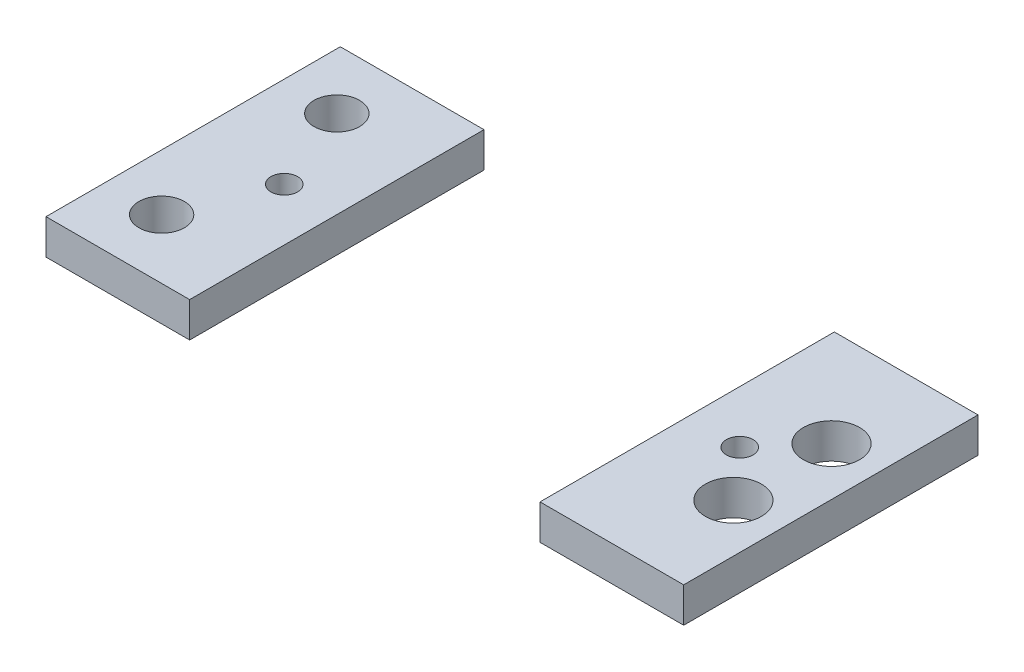
ISO-10303-21;
HEADER;
FILE_DESCRIPTION(('STEP AP214'),'2;1');
FILE_NAME('part.step','',(''),(''),'','','');
FILE_SCHEMA(('AUTOMOTIVE_DESIGN { 1 0 10303 214 1 1 1 1 }'));
ENDSEC;
DATA;
#1=APPLICATION_CONTEXT('core data for automotive mechanical design processes');
#2=APPLICATION_PROTOCOL_DEFINITION('international standard','automotive_design',2000,#1);
#3=PRODUCT_CONTEXT('',#1,'mechanical');
#4=PRODUCT('Part','Part','',(#3));
#5=PRODUCT_RELATED_PRODUCT_CATEGORY('part','',(#4));
#6=PRODUCT_DEFINITION_FORMATION('','',#4);
#7=PRODUCT_DEFINITION_CONTEXT('part definition',#1,'design');
#8=PRODUCT_DEFINITION('design','',#6,#7);
#9=PRODUCT_DEFINITION_SHAPE('','',#8);
#10=(LENGTH_UNIT() NAMED_UNIT(*) SI_UNIT(.MILLI.,.METRE.));
#11=(NAMED_UNIT(*) PLANE_ANGLE_UNIT() SI_UNIT($,.RADIAN.));
#12=(NAMED_UNIT(*) SI_UNIT($,.STERADIAN.) SOLID_ANGLE_UNIT());
#13=UNCERTAINTY_MEASURE_WITH_UNIT(LENGTH_MEASURE(1.E-05),#10,'distance_accuracy_value','');
#14=(GEOMETRIC_REPRESENTATION_CONTEXT(3) GLOBAL_UNCERTAINTY_ASSIGNED_CONTEXT((#13)) GLOBAL_UNIT_ASSIGNED_CONTEXT((#10,
#11,#12)) REPRESENTATION_CONTEXT('',''));
#15=CARTESIAN_POINT('',(0.,0.,0.));
#16=DIRECTION('',(0.,0.,1.));
#17=DIRECTION('',(1.,0.,0.));
#18=AXIS2_PLACEMENT_3D('',#15,#16,#17);
#19=CARTESIAN_POINT('',(0.,5.,0.));
#20=DIRECTION('',(0.,0.,-1.));
#21=DIRECTION('',(-1.,0.,0.));
#22=AXIS2_PLACEMENT_3D('',#19,#20,#21);
#23=PLANE('',#22);
#24=DIRECTION('',(1.,0.,0.));
#25=VECTOR('',#24,1.);
#26=CARTESIAN_POINT('',(0.,0.,0.));
#27=LINE('',#26,#25);
#28=CARTESIAN_POINT('',(0.,0.,0.));
#29=VERTEX_POINT('',#28);
#30=CARTESIAN_POINT('',(20.5,0.,0.));
#31=VERTEX_POINT('',#30);
#32=EDGE_CURVE('E47',#29,#31,#27,.T.);
#33=ORIENTED_EDGE('',*,*,#32,.T.);
#34=DIRECTION('',(0.,1.,0.));
#35=VECTOR('',#34,1.);
#36=CARTESIAN_POINT('',(20.5,-5.,0.));
#37=LINE('',#36,#35);
#38=CARTESIAN_POINT('',(20.5,5.,0.));
#39=VERTEX_POINT('',#38);
#40=EDGE_CURVE('E60',#31,#39,#37,.T.);
#41=ORIENTED_EDGE('',*,*,#40,.T.);
#42=DIRECTION('',(1.,0.,0.));
#43=VECTOR('',#42,1.);
#44=CARTESIAN_POINT('',(0.,5.,0.));
#45=LINE('',#44,#43);
#46=CARTESIAN_POINT('',(0.,5.,0.));
#47=VERTEX_POINT('',#46);
#48=EDGE_CURVE('E92',#47,#39,#45,.T.);
#49=ORIENTED_EDGE('',*,*,#48,.F.);
#50=DIRECTION('',(0.,-1.,0.));
#51=VECTOR('',#50,1.);
#52=CARTESIAN_POINT('',(0.,5.,0.));
#53=LINE('',#52,#51);
#54=EDGE_CURVE('E103',#47,#29,#53,.T.);
#55=ORIENTED_EDGE('',*,*,#54,.T.);
#56=EDGE_LOOP('',(#33,#41,#49,#55));
#57=FACE_BOUND('',#56,.T.);
#58=ADVANCED_FACE('F44',(#57),#23,.F.);
#59=CARTESIAN_POINT('',(0.,5.,-42.));
#60=DIRECTION('',(0.,0.,1.));
#61=DIRECTION('',(1.,0.,0.));
#62=AXIS2_PLACEMENT_3D('',#59,#60,#61);
#63=PLANE('',#62);
#64=DIRECTION('',(-1.,0.,0.));
#65=VECTOR('',#64,1.);
#66=CARTESIAN_POINT('',(0.,5.,-42.));
#67=LINE('',#66,#65);
#68=CARTESIAN_POINT('',(20.5,5.,-42.));
#69=VERTEX_POINT('',#68);
#70=CARTESIAN_POINT('',(0.,5.,-42.));
#71=VERTEX_POINT('',#70);
#72=EDGE_CURVE('E90',#69,#71,#67,.T.);
#73=ORIENTED_EDGE('',*,*,#72,.F.);
#74=DIRECTION('',(0.,1.,0.));
#75=VECTOR('',#74,1.);
#76=CARTESIAN_POINT('',(20.5,-5.,-42.));
#77=LINE('',#76,#75);
#78=CARTESIAN_POINT('',(20.5,0.,-42.));
#79=VERTEX_POINT('',#78);
#80=EDGE_CURVE('E53',#79,#69,#77,.T.);
#81=ORIENTED_EDGE('',*,*,#80,.F.);
#82=DIRECTION('',(-1.,0.,0.));
#83=VECTOR('',#82,1.);
#84=CARTESIAN_POINT('',(0.,0.,-42.));
#85=LINE('',#84,#83);
#86=CARTESIAN_POINT('',(0.,0.,-42.));
#87=VERTEX_POINT('',#86);
#88=EDGE_CURVE('E101',#79,#87,#85,.T.);
#89=ORIENTED_EDGE('',*,*,#88,.T.);
#90=DIRECTION('',(0.,-1.,0.));
#91=VECTOR('',#90,1.);
#92=CARTESIAN_POINT('',(0.,5.,-42.));
#93=LINE('',#92,#91);
#94=EDGE_CURVE('E95',#71,#87,#93,.T.);
#95=ORIENTED_EDGE('',*,*,#94,.F.);
#96=EDGE_LOOP('',(#73,#81,#89,#95));
#97=FACE_BOUND('',#96,.T.);
#98=ADVANCED_FACE('F93',(#97),#63,.F.);
#99=CARTESIAN_POINT('',(0.,5.,0.));
#100=DIRECTION('',(0.,-1.,0.));
#101=DIRECTION('',(0.,0.,-1.));
#102=AXIS2_PLACEMENT_3D('',#99,#100,#101);
#103=PLANE('',#102);
#104=CARTESIAN_POINT('',(13.,5.,-21.));
#105=DIRECTION('',(0.,1.,0.));
#106=DIRECTION('',(0.,0.,1.));
#107=AXIS2_PLACEMENT_3D('',#104,#105,#106);
#108=CIRCLE('',#107,1.9);
#109=CARTESIAN_POINT('',(13.,5.,-19.1));
#110=VERTEX_POINT('',#109);
#111=EDGE_CURVE('E114',#110,#110,#108,.T.);
#112=ORIENTED_EDGE('',*,*,#111,.F.);
#113=EDGE_LOOP('',(#112));
#114=FACE_BOUND('',#113,.T.);
#115=CARTESIAN_POINT('',(8.,5.,-8.5));
#116=DIRECTION('',(0.,1.,0.));
#117=DIRECTION('',(0.,0.,1.));
#118=AXIS2_PLACEMENT_3D('',#115,#116,#117);
#119=CIRCLE('',#118,3.25);
#120=CARTESIAN_POINT('',(8.,5.,-5.25));
#121=VERTEX_POINT('',#120);
#122=EDGE_CURVE('E120',#121,#121,#119,.T.);
#123=ORIENTED_EDGE('',*,*,#122,.F.);
#124=EDGE_LOOP('',(#123));
#125=FACE_BOUND('',#124,.T.);
#126=CARTESIAN_POINT('',(8.,5.,-33.5));
#127=DIRECTION('',(0.,1.,0.));
#128=DIRECTION('',(0.,0.,1.));
#129=AXIS2_PLACEMENT_3D('',#126,#127,#128);
#130=CIRCLE('',#129,3.25);
#131=CARTESIAN_POINT('',(8.,5.,-30.25));
#132=VERTEX_POINT('',#131);
#133=EDGE_CURVE('E126',#132,#132,#130,.T.);
#134=ORIENTED_EDGE('',*,*,#133,.F.);
#135=EDGE_LOOP('',(#134));
#136=FACE_BOUND('',#135,.T.);
#137=ORIENTED_EDGE('',*,*,#48,.T.);
#138=DIRECTION('',(0.,0.,1.));
#139=VECTOR('',#138,1.);
#140=CARTESIAN_POINT('',(20.5,5.,-42.));
#141=LINE('',#140,#139);
#142=EDGE_CURVE('E12',#69,#39,#141,.T.);
#143=ORIENTED_EDGE('',*,*,#142,.F.);
#144=ORIENTED_EDGE('',*,*,#72,.T.);
#145=DIRECTION('',(0.,0.,1.));
#146=VECTOR('',#145,1.);
#147=CARTESIAN_POINT('',(0.,5.,0.));
#148=LINE('',#147,#146);
#149=EDGE_CURVE('E97',#71,#47,#148,.T.);
#150=ORIENTED_EDGE('',*,*,#149,.T.);
#151=EDGE_LOOP('',(#137,#143,#144,#150));
#152=FACE_BOUND('',#151,.T.);
#153=ADVANCED_FACE('F88',(#114,#125,#136,#152),#103,.F.);
#154=CARTESIAN_POINT('',(0.,0.,0.));
#155=DIRECTION('',(0.,-1.,0.));
#156=DIRECTION('',(0.,0.,-1.));
#157=AXIS2_PLACEMENT_3D('',#154,#155,#156);
#158=PLANE('',#157);
#159=DIRECTION('',(0.,0.,-1.));
#160=VECTOR('',#159,1.);
#161=CARTESIAN_POINT('',(20.5,0.,0.));
#162=LINE('',#161,#160);
#163=EDGE_CURVE('E81',#31,#79,#162,.T.);
#164=ORIENTED_EDGE('',*,*,#163,.F.);
#165=ORIENTED_EDGE('',*,*,#32,.F.);
#166=DIRECTION('',(0.,0.,1.));
#167=VECTOR('',#166,1.);
#168=CARTESIAN_POINT('',(0.,0.,0.));
#169=LINE('',#168,#167);
#170=EDGE_CURVE('E115',#87,#29,#169,.T.);
#171=ORIENTED_EDGE('',*,*,#170,.F.);
#172=ORIENTED_EDGE('',*,*,#88,.F.);
#173=EDGE_LOOP('',(#164,#165,#171,#172));
#174=FACE_BOUND('',#173,.T.);
#175=CARTESIAN_POINT('',(13.,0.,-21.));
#176=DIRECTION('',(0.,1.,0.));
#177=DIRECTION('',(0.,0.,1.));
#178=AXIS2_PLACEMENT_3D('',#175,#176,#177);
#179=CIRCLE('',#178,1.9);
#180=CARTESIAN_POINT('',(13.,0.,-19.1));
#181=VERTEX_POINT('',#180);
#182=EDGE_CURVE('E99',#181,#181,#179,.T.);
#183=ORIENTED_EDGE('',*,*,#182,.T.);
#184=EDGE_LOOP('',(#183));
#185=FACE_BOUND('',#184,.T.);
#186=CARTESIAN_POINT('',(8.,0.,-8.5));
#187=DIRECTION('',(0.,1.,0.));
#188=DIRECTION('',(0.,0.,1.));
#189=AXIS2_PLACEMENT_3D('',#186,#187,#188);
#190=CIRCLE('',#189,3.25);
#191=CARTESIAN_POINT('',(8.,0.,-5.25));
#192=VERTEX_POINT('',#191);
#193=EDGE_CURVE('E123',#192,#192,#190,.T.);
#194=ORIENTED_EDGE('',*,*,#193,.T.);
#195=EDGE_LOOP('',(#194));
#196=FACE_BOUND('',#195,.T.);
#197=CARTESIAN_POINT('',(8.,0.,-33.5));
#198=DIRECTION('',(0.,1.,0.));
#199=DIRECTION('',(0.,0.,1.));
#200=AXIS2_PLACEMENT_3D('',#197,#198,#199);
#201=CIRCLE('',#200,3.25);
#202=CARTESIAN_POINT('',(8.,0.,-30.25));
#203=VERTEX_POINT('',#202);
#204=EDGE_CURVE('E116',#203,#203,#201,.T.);
#205=ORIENTED_EDGE('',*,*,#204,.T.);
#206=EDGE_LOOP('',(#205));
#207=FACE_BOUND('',#206,.T.);
#208=ADVANCED_FACE('F134',(#174,#185,#196,#207),#158,.T.);
#209=CARTESIAN_POINT('',(0.,5.,0.));
#210=DIRECTION('',(1.,0.,0.));
#211=DIRECTION('',(0.,0.,-1.));
#212=AXIS2_PLACEMENT_3D('',#209,#210,#211);
#213=PLANE('',#212);
#214=ORIENTED_EDGE('',*,*,#170,.T.);
#215=ORIENTED_EDGE('',*,*,#54,.F.);
#216=ORIENTED_EDGE('',*,*,#149,.F.);
#217=ORIENTED_EDGE('',*,*,#94,.T.);
#218=EDGE_LOOP('',(#214,#215,#216,#217));
#219=FACE_BOUND('',#218,.T.);
#220=ADVANCED_FACE('F150',(#219),#213,.F.);
#221=CARTESIAN_POINT('',(13.,0.,-21.));
#222=DIRECTION('',(0.,1.,0.));
#223=DIRECTION('',(0.,0.,1.));
#224=AXIS2_PLACEMENT_3D('',#221,#222,#223);
#225=CYLINDRICAL_SURFACE('',#224,1.9);
#226=ORIENTED_EDGE('',*,*,#182,.F.);
#227=EDGE_LOOP('',(#226));
#228=FACE_BOUND('',#227,.T.);
#229=ORIENTED_EDGE('',*,*,#111,.T.);
#230=EDGE_LOOP('',(#229));
#231=FACE_BOUND('',#230,.T.);
#232=ADVANCED_FACE('F163',(#228,#231),#225,.F.);
#233=CARTESIAN_POINT('',(8.,0.,-8.5));
#234=DIRECTION('',(0.,1.,0.));
#235=DIRECTION('',(0.,0.,1.));
#236=AXIS2_PLACEMENT_3D('',#233,#234,#235);
#237=CYLINDRICAL_SURFACE('',#236,3.25);
#238=ORIENTED_EDGE('',*,*,#193,.F.);
#239=EDGE_LOOP('',(#238));
#240=FACE_BOUND('',#239,.T.);
#241=ORIENTED_EDGE('',*,*,#122,.T.);
#242=EDGE_LOOP('',(#241));
#243=FACE_BOUND('',#242,.T.);
#244=ADVANCED_FACE('F139',(#240,#243),#237,.F.);
#245=CARTESIAN_POINT('',(8.,0.,-33.5));
#246=DIRECTION('',(0.,1.,0.));
#247=DIRECTION('',(0.,0.,1.));
#248=AXIS2_PLACEMENT_3D('',#245,#246,#247);
#249=CYLINDRICAL_SURFACE('',#248,3.25);
#250=ORIENTED_EDGE('',*,*,#204,.F.);
#251=EDGE_LOOP('',(#250));
#252=FACE_BOUND('',#251,.T.);
#253=ORIENTED_EDGE('',*,*,#133,.T.);
#254=EDGE_LOOP('',(#253));
#255=FACE_BOUND('',#254,.T.);
#256=ADVANCED_FACE('F136',(#252,#255),#249,.F.);
#257=CARTESIAN_POINT('',(20.5,-5.,-42.));
#258=DIRECTION('',(-1.,0.,0.));
#259=DIRECTION('',(0.,0.,1.));
#260=AXIS2_PLACEMENT_3D('',#257,#258,#259);
#261=PLANE('',#260);
#262=ORIENTED_EDGE('',*,*,#163,.T.);
#263=ORIENTED_EDGE('',*,*,#80,.T.);
#264=ORIENTED_EDGE('',*,*,#142,.T.);
#265=ORIENTED_EDGE('',*,*,#40,.F.);
#266=EDGE_LOOP('',(#262,#263,#264,#265));
#267=FACE_BOUND('',#266,.T.);
#268=ADVANCED_FACE('F80',(#267),#261,.F.);
#269=CLOSED_SHELL('',(#58,#98,#153,#208,#220,#232,#244,#256,#268));
#270=MANIFOLD_SOLID_BREP('B2',#269);
#271=CARTESIAN_POINT('',(78.,0.,-21.));
#272=DIRECTION('',(0.,1.,0.));
#273=DIRECTION('',(0.,0.,1.));
#274=AXIS2_PLACEMENT_3D('',#271,#272,#273);
#275=CYLINDRICAL_SURFACE('',#274,1.9);
#276=CARTESIAN_POINT('',(78.,0.,-21.));
#277=DIRECTION('',(0.,1.,0.));
#278=DIRECTION('',(0.,0.,1.));
#279=AXIS2_PLACEMENT_3D('',#276,#277,#278);
#280=CIRCLE('',#279,1.9);
#281=CARTESIAN_POINT('',(78.,0.,-19.1));
#282=VERTEX_POINT('',#281);
#283=EDGE_CURVE('E290',#282,#282,#280,.T.);
#284=ORIENTED_EDGE('',*,*,#283,.F.);
#285=EDGE_LOOP('',(#284));
#286=FACE_BOUND('',#285,.T.);
#287=CARTESIAN_POINT('',(78.,5.,-21.));
#288=DIRECTION('',(0.,1.,0.));
#289=DIRECTION('',(0.,0.,1.));
#290=AXIS2_PLACEMENT_3D('',#287,#288,#289);
#291=CIRCLE('',#290,1.9);
#292=CARTESIAN_POINT('',(78.,5.,-19.1));
#293=VERTEX_POINT('',#292);
#294=EDGE_CURVE('E293',#293,#293,#291,.T.);
#295=ORIENTED_EDGE('',*,*,#294,.T.);
#296=EDGE_LOOP('',(#295));
#297=FACE_BOUND('',#296,.T.);
#298=ADVANCED_FACE('F230',(#286,#297),#275,.F.);
#299=CARTESIAN_POINT('',(84.0948730147645,0.,-28.));
#300=DIRECTION('',(0.,1.,0.));
#301=DIRECTION('',(0.,0.,1.));
#302=AXIS2_PLACEMENT_3D('',#299,#300,#301);
#303=CYLINDRICAL_SURFACE('',#302,4.00000000000001);
#304=CARTESIAN_POINT('',(84.0948730147645,0.,-28.));
#305=DIRECTION('',(0.,1.,0.));
#306=DIRECTION('',(0.,0.,1.));
#307=AXIS2_PLACEMENT_3D('',#304,#305,#306);
#308=CIRCLE('',#307,4.00000000000001);
#309=CARTESIAN_POINT('',(84.0948730147645,0.,-24.));
#310=VERTEX_POINT('',#309);
#311=EDGE_CURVE('E296',#310,#310,#308,.T.);
#312=ORIENTED_EDGE('',*,*,#311,.F.);
#313=EDGE_LOOP('',(#312));
#314=FACE_BOUND('',#313,.T.);
#315=CARTESIAN_POINT('',(84.0948730147645,5.,-28.));
#316=DIRECTION('',(0.,1.,0.));
#317=DIRECTION('',(0.,0.,1.));
#318=AXIS2_PLACEMENT_3D('',#315,#316,#317);
#319=CIRCLE('',#318,4.00000000000001);
#320=CARTESIAN_POINT('',(84.0948730147645,5.,-24.));
#321=VERTEX_POINT('',#320);
#322=EDGE_CURVE('E299',#321,#321,#319,.T.);
#323=ORIENTED_EDGE('',*,*,#322,.T.);
#324=EDGE_LOOP('',(#323));
#325=FACE_BOUND('',#324,.T.);
#326=ADVANCED_FACE('F337',(#314,#325),#303,.F.);
#327=CARTESIAN_POINT('',(84.0948730147645,0.,-14.));
#328=DIRECTION('',(0.,1.,0.));
#329=DIRECTION('',(0.,0.,1.));
#330=AXIS2_PLACEMENT_3D('',#327,#328,#329);
#331=CYLINDRICAL_SURFACE('',#330,4.00000000000001);
#332=CARTESIAN_POINT('',(84.0948730147645,0.,-14.));
#333=DIRECTION('',(0.,1.,0.));
#334=DIRECTION('',(0.,0.,1.));
#335=AXIS2_PLACEMENT_3D('',#332,#333,#334);
#336=CIRCLE('',#335,4.00000000000001);
#337=CARTESIAN_POINT('',(84.0948730147645,0.,-9.99999999999999));
#338=VERTEX_POINT('',#337);
#339=EDGE_CURVE('E302',#338,#338,#336,.T.);
#340=ORIENTED_EDGE('',*,*,#339,.F.);
#341=EDGE_LOOP('',(#340));
#342=FACE_BOUND('',#341,.T.);
#343=CARTESIAN_POINT('',(84.0948730147645,5.,-14.));
#344=DIRECTION('',(0.,1.,0.));
#345=DIRECTION('',(0.,0.,1.));
#346=AXIS2_PLACEMENT_3D('',#343,#344,#345);
#347=CIRCLE('',#346,4.00000000000001);
#348=CARTESIAN_POINT('',(84.0948730147645,5.,-9.99999999999999));
#349=VERTEX_POINT('',#348);
#350=EDGE_CURVE('E305',#349,#349,#347,.T.);
#351=ORIENTED_EDGE('',*,*,#350,.T.);
#352=EDGE_LOOP('',(#351));
#353=FACE_BOUND('',#352,.T.);
#354=ADVANCED_FACE('F332',(#342,#353),#331,.F.);
#355=CARTESIAN_POINT('',(91.,5.,0.));
#356=DIRECTION('',(-1.,0.,0.));
#357=DIRECTION('',(0.,0.,1.));
#358=AXIS2_PLACEMENT_3D('',#355,#356,#357);
#359=PLANE('',#358);
#360=DIRECTION('',(0.,0.,-1.));
#361=VECTOR('',#360,1.);
#362=CARTESIAN_POINT('',(91.,0.,0.));
#363=LINE('',#362,#361);
#364=CARTESIAN_POINT('',(91.,0.,0.));
#365=VERTEX_POINT('',#364);
#366=CARTESIAN_POINT('',(91.,0.,-42.));
#367=VERTEX_POINT('',#366);
#368=EDGE_CURVE('E266',#365,#367,#363,.T.);
#369=ORIENTED_EDGE('',*,*,#368,.T.);
#370=DIRECTION('',(0.,-1.,0.));
#371=VECTOR('',#370,1.);
#372=CARTESIAN_POINT('',(91.,5.,-42.));
#373=LINE('',#372,#371);
#374=CARTESIAN_POINT('',(91.,5.,-42.));
#375=VERTEX_POINT('',#374);
#376=EDGE_CURVE('E269',#375,#367,#373,.T.);
#377=ORIENTED_EDGE('',*,*,#376,.F.);
#378=DIRECTION('',(0.,0.,-1.));
#379=VECTOR('',#378,1.);
#380=CARTESIAN_POINT('',(91.,5.,0.));
#381=LINE('',#380,#379);
#382=CARTESIAN_POINT('',(91.,5.,0.));
#383=VERTEX_POINT('',#382);
#384=EDGE_CURVE('E253',#383,#375,#381,.T.);
#385=ORIENTED_EDGE('',*,*,#384,.F.);
#386=DIRECTION('',(0.,-1.,0.));
#387=VECTOR('',#386,1.);
#388=CARTESIAN_POINT('',(91.,5.,0.));
#389=LINE('',#388,#387);
#390=EDGE_CURVE('E238',#383,#365,#389,.T.);
#391=ORIENTED_EDGE('',*,*,#390,.T.);
#392=EDGE_LOOP('',(#369,#377,#385,#391));
#393=FACE_BOUND('',#392,.T.);
#394=ADVANCED_FACE('F268',(#393),#359,.F.);
#395=CARTESIAN_POINT('',(0.,5.,0.));
#396=DIRECTION('',(0.,-1.,0.));
#397=DIRECTION('',(0.,0.,-1.));
#398=AXIS2_PLACEMENT_3D('',#395,#396,#397);
#399=PLANE('',#398);
#400=ORIENTED_EDGE('',*,*,#350,.F.);
#401=EDGE_LOOP('',(#400));
#402=FACE_BOUND('',#401,.T.);
#403=ORIENTED_EDGE('',*,*,#322,.F.);
#404=EDGE_LOOP('',(#403));
#405=FACE_BOUND('',#404,.T.);
#406=ORIENTED_EDGE('',*,*,#294,.F.);
#407=EDGE_LOOP('',(#406));
#408=FACE_BOUND('',#407,.T.);
#409=DIRECTION('',(-1.,0.,0.));
#410=VECTOR('',#409,1.);
#411=CARTESIAN_POINT('',(0.,5.,-42.));
#412=LINE('',#411,#410);
#413=CARTESIAN_POINT('',(70.5,5.,-42.));
#414=VERTEX_POINT('',#413);
#415=EDGE_CURVE('E281',#375,#414,#412,.T.);
#416=ORIENTED_EDGE('',*,*,#415,.T.);
#417=DIRECTION('',(0.,0.,-1.));
#418=VECTOR('',#417,1.);
#419=CARTESIAN_POINT('',(70.5,5.,-42.));
#420=LINE('',#419,#418);
#421=CARTESIAN_POINT('',(70.5,5.,0.));
#422=VERTEX_POINT('',#421);
#423=EDGE_CURVE('E313',#422,#414,#420,.T.);
#424=ORIENTED_EDGE('',*,*,#423,.F.);
#425=DIRECTION('',(1.,0.,0.));
#426=VECTOR('',#425,1.);
#427=CARTESIAN_POINT('',(0.,5.,0.));
#428=LINE('',#427,#426);
#429=EDGE_CURVE('E285',#422,#383,#428,.T.);
#430=ORIENTED_EDGE('',*,*,#429,.T.);
#431=ORIENTED_EDGE('',*,*,#384,.T.);
#432=EDGE_LOOP('',(#416,#424,#430,#431));
#433=FACE_BOUND('',#432,.T.);
#434=ADVANCED_FACE('F322',(#402,#405,#408,#433),#399,.F.);
#435=CARTESIAN_POINT('',(0.,0.,0.));
#436=DIRECTION('',(0.,-1.,0.));
#437=DIRECTION('',(0.,0.,-1.));
#438=AXIS2_PLACEMENT_3D('',#435,#436,#437);
#439=PLANE('',#438);
#440=DIRECTION('',(0.,0.,1.));
#441=VECTOR('',#440,1.);
#442=CARTESIAN_POINT('',(70.5,0.,0.));
#443=LINE('',#442,#441);
#444=CARTESIAN_POINT('',(70.5,0.,-42.));
#445=VERTEX_POINT('',#444);
#446=CARTESIAN_POINT('',(70.5,0.,0.));
#447=VERTEX_POINT('',#446);
#448=EDGE_CURVE('E42',#445,#447,#443,.T.);
#449=ORIENTED_EDGE('',*,*,#448,.F.);
#450=DIRECTION('',(-1.,0.,0.));
#451=VECTOR('',#450,1.);
#452=CARTESIAN_POINT('',(0.,0.,-42.));
#453=LINE('',#452,#451);
#454=EDGE_CURVE('E275',#367,#445,#453,.T.);
#455=ORIENTED_EDGE('',*,*,#454,.F.);
#456=ORIENTED_EDGE('',*,*,#368,.F.);
#457=DIRECTION('',(1.,0.,0.));
#458=VECTOR('',#457,1.);
#459=CARTESIAN_POINT('',(0.,0.,0.));
#460=LINE('',#459,#458);
#461=EDGE_CURVE('E276',#447,#365,#460,.T.);
#462=ORIENTED_EDGE('',*,*,#461,.F.);
#463=EDGE_LOOP('',(#449,#455,#456,#462));
#464=FACE_BOUND('',#463,.T.);
#465=ORIENTED_EDGE('',*,*,#339,.T.);
#466=EDGE_LOOP('',(#465));
#467=FACE_BOUND('',#466,.T.);
#468=ORIENTED_EDGE('',*,*,#311,.T.);
#469=EDGE_LOOP('',(#468));
#470=FACE_BOUND('',#469,.T.);
#471=ORIENTED_EDGE('',*,*,#283,.T.);
#472=EDGE_LOOP('',(#471));
#473=FACE_BOUND('',#472,.T.);
#474=ADVANCED_FACE('F283',(#464,#467,#470,#473),#439,.T.);
#475=CARTESIAN_POINT('',(0.,5.,-42.));
#476=DIRECTION('',(0.,0.,1.));
#477=DIRECTION('',(1.,0.,0.));
#478=AXIS2_PLACEMENT_3D('',#475,#476,#477);
#479=PLANE('',#478);
#480=ORIENTED_EDGE('',*,*,#454,.T.);
#481=DIRECTION('',(0.,1.,0.));
#482=VECTOR('',#481,1.);
#483=CARTESIAN_POINT('',(70.5,-5.,-42.));
#484=LINE('',#483,#482);
#485=EDGE_CURVE('E244',#445,#414,#484,.T.);
#486=ORIENTED_EDGE('',*,*,#485,.T.);
#487=ORIENTED_EDGE('',*,*,#415,.F.);
#488=ORIENTED_EDGE('',*,*,#376,.T.);
#489=EDGE_LOOP('',(#480,#486,#487,#488));
#490=FACE_BOUND('',#489,.T.);
#491=ADVANCED_FACE('F280',(#490),#479,.F.);
#492=CARTESIAN_POINT('',(0.,5.,0.));
#493=DIRECTION('',(0.,0.,-1.));
#494=DIRECTION('',(-1.,0.,0.));
#495=AXIS2_PLACEMENT_3D('',#492,#493,#494);
#496=PLANE('',#495);
#497=ORIENTED_EDGE('',*,*,#429,.F.);
#498=DIRECTION('',(0.,1.,0.));
#499=VECTOR('',#498,1.);
#500=CARTESIAN_POINT('',(70.5,-5.,0.));
#501=LINE('',#500,#499);
#502=EDGE_CURVE('E310',#447,#422,#501,.T.);
#503=ORIENTED_EDGE('',*,*,#502,.F.);
#504=ORIENTED_EDGE('',*,*,#461,.T.);
#505=ORIENTED_EDGE('',*,*,#390,.F.);
#506=EDGE_LOOP('',(#497,#503,#504,#505));
#507=FACE_BOUND('',#506,.T.);
#508=ADVANCED_FACE('F232',(#507),#496,.F.);
#509=CARTESIAN_POINT('',(70.5,-5.,-42.));
#510=DIRECTION('',(1.,0.,0.));
#511=DIRECTION('',(0.,0.,-1.));
#512=AXIS2_PLACEMENT_3D('',#509,#510,#511);
#513=PLANE('',#512);
#514=ORIENTED_EDGE('',*,*,#448,.T.);
#515=ORIENTED_EDGE('',*,*,#502,.T.);
#516=ORIENTED_EDGE('',*,*,#423,.T.);
#517=ORIENTED_EDGE('',*,*,#485,.F.);
#518=EDGE_LOOP('',(#514,#515,#516,#517));
#519=FACE_BOUND('',#518,.T.);
#520=ADVANCED_FACE('F317',(#519),#513,.F.);
#521=CLOSED_SHELL('',(#298,#326,#354,#394,#434,#474,#491,#508,#520));
#522=MANIFOLD_SOLID_BREP('B6',#521);
#523=ADVANCED_BREP_SHAPE_REPRESENTATION('',(#18,#270,#522),#14);
#524=SHAPE_DEFINITION_REPRESENTATION(#9,#523);
ENDSEC;
END-ISO-10303-21;
